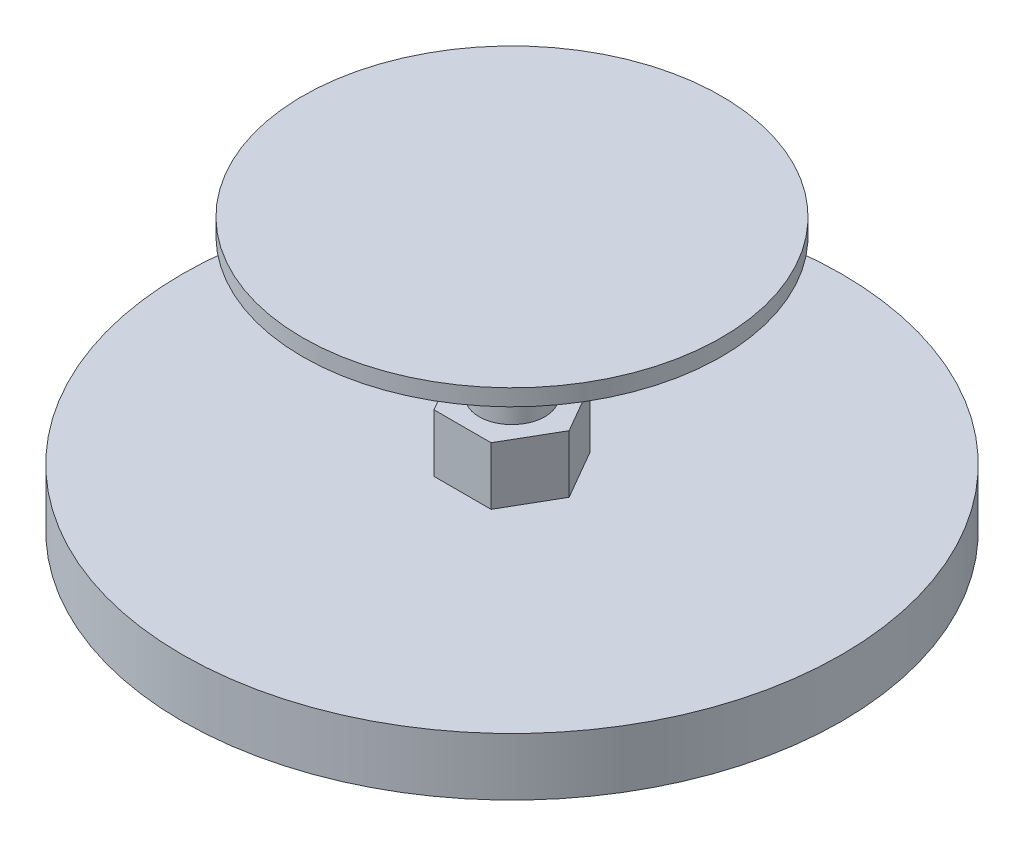
ISO-10303-21;
HEADER;
FILE_DESCRIPTION(('STEP AP214'),'2;1');
FILE_NAME('part.step','',(''),(''),'','','');
FILE_SCHEMA(('AUTOMOTIVE_DESIGN { 1 0 10303 214 1 1 1 1 }'));
ENDSEC;
DATA;
#1=APPLICATION_CONTEXT('core data for automotive mechanical design processes');
#2=APPLICATION_PROTOCOL_DEFINITION('international standard','automotive_design',2000,#1);
#3=PRODUCT_CONTEXT('',#1,'mechanical');
#4=PRODUCT('Part','Part','',(#3));
#5=PRODUCT_RELATED_PRODUCT_CATEGORY('part','',(#4));
#6=PRODUCT_DEFINITION_FORMATION('','',#4);
#7=PRODUCT_DEFINITION_CONTEXT('part definition',#1,'design');
#8=PRODUCT_DEFINITION('design','',#6,#7);
#9=PRODUCT_DEFINITION_SHAPE('','',#8);
#10=(LENGTH_UNIT() NAMED_UNIT(*) SI_UNIT(.MILLI.,.METRE.));
#11=(NAMED_UNIT(*) PLANE_ANGLE_UNIT() SI_UNIT($,.RADIAN.));
#12=(NAMED_UNIT(*) SI_UNIT($,.STERADIAN.) SOLID_ANGLE_UNIT());
#13=UNCERTAINTY_MEASURE_WITH_UNIT(LENGTH_MEASURE(1.E-05),#10,'distance_accuracy_value','');
#14=(GEOMETRIC_REPRESENTATION_CONTEXT(3) GLOBAL_UNCERTAINTY_ASSIGNED_CONTEXT((#13)) GLOBAL_UNIT_ASSIGNED_CONTEXT((#10,
#11,#12)) REPRESENTATION_CONTEXT('',''));
#15=CARTESIAN_POINT('',(0.,0.,0.));
#16=DIRECTION('',(0.,0.,1.));
#17=DIRECTION('',(1.,0.,0.));
#18=AXIS2_PLACEMENT_3D('',#15,#16,#17);
#19=CARTESIAN_POINT('',(6.92820323027551,14.,0.));
#20=DIRECTION('',(0.,1.,0.));
#21=DIRECTION('',(0.,0.,1.));
#22=AXIS2_PLACEMENT_3D('',#19,#20,#21);
#23=PLANE('',#22);
#24=DIRECTION('',(0.5,0.,-0.866025403784439));
#25=VECTOR('',#24,1.);
#26=CARTESIAN_POINT('',(3.46410161513775,14.,6.));
#27=LINE('',#26,#25);
#28=CARTESIAN_POINT('',(3.46410161513775,14.,6.));
#29=VERTEX_POINT('',#28);
#30=CARTESIAN_POINT('',(6.92820323027551,14.,0.));
#31=VERTEX_POINT('',#30);
#32=EDGE_CURVE('E131',#29,#31,#27,.T.);
#33=ORIENTED_EDGE('',*,*,#32,.T.);
#34=DIRECTION('',(-0.5,0.,-0.866025403784438));
#35=VECTOR('',#34,1.);
#36=CARTESIAN_POINT('',(6.92820323027551,14.,0.));
#37=LINE('',#36,#35);
#38=CARTESIAN_POINT('',(3.46410161513775,14.,-6.00000000000001));
#39=VERTEX_POINT('',#38);
#40=EDGE_CURVE('E83',#31,#39,#37,.T.);
#41=ORIENTED_EDGE('',*,*,#40,.T.);
#42=DIRECTION('',(-1.,0.,0.));
#43=VECTOR('',#42,1.);
#44=CARTESIAN_POINT('',(3.46410161513775,14.,-6.00000000000001));
#45=LINE('',#44,#43);
#46=CARTESIAN_POINT('',(-3.46410161513775,14.,-6.00000000000001));
#47=VERTEX_POINT('',#46);
#48=EDGE_CURVE('E99',#39,#47,#45,.T.);
#49=ORIENTED_EDGE('',*,*,#48,.T.);
#50=DIRECTION('',(-0.5,0.,0.866025403784439));
#51=VECTOR('',#50,1.);
#52=CARTESIAN_POINT('',(-3.46410161513775,14.,-6.00000000000001));
#53=LINE('',#52,#51);
#54=CARTESIAN_POINT('',(-6.92820323027551,14.,0.));
#55=VERTEX_POINT('',#54);
#56=EDGE_CURVE('E93',#47,#55,#53,.T.);
#57=ORIENTED_EDGE('',*,*,#56,.T.);
#58=DIRECTION('',(0.5,0.,0.866025403784439));
#59=VECTOR('',#58,1.);
#60=CARTESIAN_POINT('',(-6.92820323027551,14.,0.));
#61=LINE('',#60,#59);
#62=CARTESIAN_POINT('',(-3.46410161513776,14.,6.));
#63=VERTEX_POINT('',#62);
#64=EDGE_CURVE('E97',#55,#63,#61,.T.);
#65=ORIENTED_EDGE('',*,*,#64,.T.);
#66=DIRECTION('',(1.,0.,0.));
#67=VECTOR('',#66,1.);
#68=CARTESIAN_POINT('',(-3.46410161513776,14.,6.));
#69=LINE('',#68,#67);
#70=EDGE_CURVE('E54',#63,#29,#69,.T.);
#71=ORIENTED_EDGE('',*,*,#70,.T.);
#72=EDGE_LOOP('',(#33,#41,#49,#57,#65,#71));
#73=FACE_BOUND('',#72,.T.);
#74=CARTESIAN_POINT('',(0.,14.,0.));
#75=DIRECTION('',(0.,1.,0.));
#76=DIRECTION('',(0.,0.,1.));
#77=AXIS2_PLACEMENT_3D('',#74,#75,#76);
#78=CIRCLE('',#77,4.);
#79=CARTESIAN_POINT('',(0.,14.,4.));
#80=VERTEX_POINT('',#79);
#81=EDGE_CURVE('E189',#80,#80,#78,.T.);
#82=ORIENTED_EDGE('',*,*,#81,.F.);
#83=EDGE_LOOP('',(#82));
#84=FACE_BOUND('',#83,.T.);
#85=ADVANCED_FACE('F31',(#73,#84),#23,.T.);
#86=CARTESIAN_POINT('',(0.,7.,0.));
#87=DIRECTION('',(0.,1.,0.));
#88=DIRECTION('',(0.,0.,1.));
#89=AXIS2_PLACEMENT_3D('',#86,#87,#88);
#90=PLANE('',#89);
#91=CARTESIAN_POINT('',(0.,7.,0.));
#92=DIRECTION('',(0.,1.,0.));
#93=DIRECTION('',(0.,0.,1.));
#94=AXIS2_PLACEMENT_3D('',#91,#92,#93);
#95=CIRCLE('',#94,40.);
#96=CARTESIAN_POINT('',(0.,7.,40.));
#97=VERTEX_POINT('',#96);
#98=EDGE_CURVE('E11',#97,#97,#95,.T.);
#99=ORIENTED_EDGE('',*,*,#98,.T.);
#100=EDGE_LOOP('',(#99));
#101=FACE_BOUND('',#100,.T.);
#102=DIRECTION('',(-0.5,0.,-0.866025403784438));
#103=VECTOR('',#102,1.);
#104=CARTESIAN_POINT('',(6.92820323027551,7.,0.));
#105=LINE('',#104,#103);
#106=CARTESIAN_POINT('',(6.92820323027551,7.,0.));
#107=VERTEX_POINT('',#106);
#108=CARTESIAN_POINT('',(3.46410161513775,7.,-6.00000000000001));
#109=VERTEX_POINT('',#108);
#110=EDGE_CURVE('E122',#107,#109,#105,.T.);
#111=ORIENTED_EDGE('',*,*,#110,.F.);
#112=DIRECTION('',(0.5,0.,-0.866025403784439));
#113=VECTOR('',#112,1.);
#114=CARTESIAN_POINT('',(3.46410161513775,7.,6.));
#115=LINE('',#114,#113);
#116=CARTESIAN_POINT('',(3.46410161513775,7.,6.));
#117=VERTEX_POINT('',#116);
#118=EDGE_CURVE('E119',#117,#107,#115,.T.);
#119=ORIENTED_EDGE('',*,*,#118,.F.);
#120=DIRECTION('',(1.,0.,0.));
#121=VECTOR('',#120,1.);
#122=CARTESIAN_POINT('',(-3.46410161513776,7.,6.));
#123=LINE('',#122,#121);
#124=CARTESIAN_POINT('',(-3.46410161513776,7.,6.));
#125=VERTEX_POINT('',#124);
#126=EDGE_CURVE('E75',#125,#117,#123,.T.);
#127=ORIENTED_EDGE('',*,*,#126,.F.);
#128=DIRECTION('',(0.5,0.,0.866025403784439));
#129=VECTOR('',#128,1.);
#130=CARTESIAN_POINT('',(-6.92820323027551,7.,0.));
#131=LINE('',#130,#129);
#132=CARTESIAN_POINT('',(-6.92820323027551,7.,0.));
#133=VERTEX_POINT('',#132);
#134=EDGE_CURVE('E128',#133,#125,#131,.T.);
#135=ORIENTED_EDGE('',*,*,#134,.F.);
#136=DIRECTION('',(-0.5,0.,0.866025403784439));
#137=VECTOR('',#136,1.);
#138=CARTESIAN_POINT('',(-3.46410161513775,7.,-6.00000000000001));
#139=LINE('',#138,#137);
#140=CARTESIAN_POINT('',(-3.46410161513775,7.,-6.00000000000001));
#141=VERTEX_POINT('',#140);
#142=EDGE_CURVE('E108',#141,#133,#139,.T.);
#143=ORIENTED_EDGE('',*,*,#142,.F.);
#144=DIRECTION('',(-1.,0.,0.));
#145=VECTOR('',#144,1.);
#146=CARTESIAN_POINT('',(3.46410161513775,7.,-6.00000000000001));
#147=LINE('',#146,#145);
#148=EDGE_CURVE('E125',#109,#141,#147,.T.);
#149=ORIENTED_EDGE('',*,*,#148,.F.);
#150=EDGE_LOOP('',(#111,#119,#127,#135,#143,#149));
#151=FACE_BOUND('',#150,.T.);
#152=ADVANCED_FACE('F154',(#101,#151),#90,.T.);
#153=CARTESIAN_POINT('',(0.,7.,0.));
#154=DIRECTION('',(0.,-1.,0.));
#155=DIRECTION('',(0.,0.,-1.));
#156=AXIS2_PLACEMENT_3D('',#153,#154,#155);
#157=CYLINDRICAL_SURFACE('',#156,40.);
#158=ORIENTED_EDGE('',*,*,#98,.F.);
#159=EDGE_LOOP('',(#158));
#160=FACE_BOUND('',#159,.T.);
#161=CARTESIAN_POINT('',(0.,0.,0.));
#162=DIRECTION('',(0.,1.,0.));
#163=DIRECTION('',(0.,0.,1.));
#164=AXIS2_PLACEMENT_3D('',#161,#162,#163);
#165=CIRCLE('',#164,40.);
#166=CARTESIAN_POINT('',(0.,0.,40.));
#167=VERTEX_POINT('',#166);
#168=EDGE_CURVE('E35',#167,#167,#165,.T.);
#169=ORIENTED_EDGE('',*,*,#168,.T.);
#170=EDGE_LOOP('',(#169));
#171=FACE_BOUND('',#170,.T.);
#172=ADVANCED_FACE('F33',(#160,#171),#157,.T.);
#173=CARTESIAN_POINT('',(0.,0.,0.));
#174=DIRECTION('',(0.,1.,0.));
#175=DIRECTION('',(0.,0.,1.));
#176=AXIS2_PLACEMENT_3D('',#173,#174,#175);
#177=PLANE('',#176);
#178=ORIENTED_EDGE('',*,*,#168,.F.);
#179=EDGE_LOOP('',(#178));
#180=FACE_BOUND('',#179,.T.);
#181=ADVANCED_FACE('F144',(#180),#177,.F.);
#182=CARTESIAN_POINT('',(3.46410161513775,14.,6.));
#183=DIRECTION('',(-0.866025403784439,0.,-0.5));
#184=DIRECTION('',(-0.5,0.,0.866025403784439));
#185=AXIS2_PLACEMENT_3D('',#182,#183,#184);
#186=PLANE('',#185);
#187=ORIENTED_EDGE('',*,*,#118,.T.);
#188=DIRECTION('',(0.,-1.,0.));
#189=VECTOR('',#188,1.);
#190=CARTESIAN_POINT('',(6.92820323027551,14.,0.));
#191=LINE('',#190,#189);
#192=EDGE_CURVE('E138',#31,#107,#191,.T.);
#193=ORIENTED_EDGE('',*,*,#192,.F.);
#194=ORIENTED_EDGE('',*,*,#32,.F.);
#195=DIRECTION('',(0.,-1.,0.));
#196=VECTOR('',#195,1.);
#197=CARTESIAN_POINT('',(3.46410161513775,14.,6.));
#198=LINE('',#197,#196);
#199=EDGE_CURVE('E115',#29,#117,#198,.T.);
#200=ORIENTED_EDGE('',*,*,#199,.T.);
#201=EDGE_LOOP('',(#187,#193,#194,#200));
#202=FACE_BOUND('',#201,.T.);
#203=ADVANCED_FACE('F146',(#202),#186,.F.);
#204=CARTESIAN_POINT('',(6.92820323027551,14.,0.));
#205=DIRECTION('',(-0.866025403784438,0.,0.5));
#206=DIRECTION('',(0.5,0.,0.866025403784439));
#207=AXIS2_PLACEMENT_3D('',#204,#205,#206);
#208=PLANE('',#207);
#209=ORIENTED_EDGE('',*,*,#110,.T.);
#210=DIRECTION('',(0.,-1.,0.));
#211=VECTOR('',#210,1.);
#212=CARTESIAN_POINT('',(3.46410161513775,14.,-6.00000000000001));
#213=LINE('',#212,#211);
#214=EDGE_CURVE('E135',#39,#109,#213,.T.);
#215=ORIENTED_EDGE('',*,*,#214,.F.);
#216=ORIENTED_EDGE('',*,*,#40,.F.);
#217=ORIENTED_EDGE('',*,*,#192,.T.);
#218=EDGE_LOOP('',(#209,#215,#216,#217));
#219=FACE_BOUND('',#218,.T.);
#220=ADVANCED_FACE('F151',(#219),#208,.F.);
#221=CARTESIAN_POINT('',(3.46410161513775,14.,-6.00000000000001));
#222=DIRECTION('',(0.,0.,1.));
#223=DIRECTION('',(1.,0.,0.));
#224=AXIS2_PLACEMENT_3D('',#221,#222,#223);
#225=PLANE('',#224);
#226=ORIENTED_EDGE('',*,*,#148,.T.);
#227=DIRECTION('',(0.,-1.,0.));
#228=VECTOR('',#227,1.);
#229=CARTESIAN_POINT('',(-3.46410161513775,14.,-6.00000000000001));
#230=LINE('',#229,#228);
#231=EDGE_CURVE('E111',#47,#141,#230,.T.);
#232=ORIENTED_EDGE('',*,*,#231,.F.);
#233=ORIENTED_EDGE('',*,*,#48,.F.);
#234=ORIENTED_EDGE('',*,*,#214,.T.);
#235=EDGE_LOOP('',(#226,#232,#233,#234));
#236=FACE_BOUND('',#235,.T.);
#237=ADVANCED_FACE('F174',(#236),#225,.F.);
#238=CARTESIAN_POINT('',(-3.46410161513775,14.,-6.00000000000001));
#239=DIRECTION('',(0.866025403784439,0.,0.5));
#240=DIRECTION('',(0.5,0.,-0.866025403784439));
#241=AXIS2_PLACEMENT_3D('',#238,#239,#240);
#242=PLANE('',#241);
#243=ORIENTED_EDGE('',*,*,#142,.T.);
#244=DIRECTION('',(0.,-1.,0.));
#245=VECTOR('',#244,1.);
#246=CARTESIAN_POINT('',(-6.92820323027551,14.,0.));
#247=LINE('',#246,#245);
#248=EDGE_CURVE('E105',#55,#133,#247,.T.);
#249=ORIENTED_EDGE('',*,*,#248,.F.);
#250=ORIENTED_EDGE('',*,*,#56,.F.);
#251=ORIENTED_EDGE('',*,*,#231,.T.);
#252=EDGE_LOOP('',(#243,#249,#250,#251));
#253=FACE_BOUND('',#252,.T.);
#254=ADVANCED_FACE('F106',(#253),#242,.F.);
#255=CARTESIAN_POINT('',(-6.92820323027551,14.,0.));
#256=DIRECTION('',(0.866025403784439,0.,-0.5));
#257=DIRECTION('',(-0.5,0.,-0.866025403784439));
#258=AXIS2_PLACEMENT_3D('',#255,#256,#257);
#259=PLANE('',#258);
#260=ORIENTED_EDGE('',*,*,#134,.T.);
#261=DIRECTION('',(0.,-1.,0.));
#262=VECTOR('',#261,1.);
#263=CARTESIAN_POINT('',(-3.46410161513776,14.,6.));
#264=LINE('',#263,#262);
#265=EDGE_CURVE('E46',#63,#125,#264,.T.);
#266=ORIENTED_EDGE('',*,*,#265,.F.);
#267=ORIENTED_EDGE('',*,*,#64,.F.);
#268=ORIENTED_EDGE('',*,*,#248,.T.);
#269=EDGE_LOOP('',(#260,#266,#267,#268));
#270=FACE_BOUND('',#269,.T.);
#271=ADVANCED_FACE('F113',(#270),#259,.F.);
#272=CARTESIAN_POINT('',(-3.46410161513776,14.,6.));
#273=DIRECTION('',(0.,0.,-1.));
#274=DIRECTION('',(-1.,0.,0.));
#275=AXIS2_PLACEMENT_3D('',#272,#273,#274);
#276=PLANE('',#275);
#277=ORIENTED_EDGE('',*,*,#126,.T.);
#278=ORIENTED_EDGE('',*,*,#199,.F.);
#279=ORIENTED_EDGE('',*,*,#70,.F.);
#280=ORIENTED_EDGE('',*,*,#265,.T.);
#281=EDGE_LOOP('',(#277,#278,#279,#280));
#282=FACE_BOUND('',#281,.T.);
#283=ADVANCED_FACE('F167',(#282),#276,.F.);
#284=CARTESIAN_POINT('',(0.,24.,0.));
#285=DIRECTION('',(0.,-1.,0.));
#286=DIRECTION('',(0.,0.,-1.));
#287=AXIS2_PLACEMENT_3D('',#284,#285,#286);
#288=CYLINDRICAL_SURFACE('',#287,4.);
#289=CARTESIAN_POINT('',(0.,24.,0.));
#290=DIRECTION('',(0.,1.,0.));
#291=DIRECTION('',(0.,0.,1.));
#292=AXIS2_PLACEMENT_3D('',#289,#290,#291);
#293=CIRCLE('',#292,4.);
#294=CARTESIAN_POINT('',(0.,24.,4.));
#295=VERTEX_POINT('',#294);
#296=EDGE_CURVE('E123',#295,#295,#293,.T.);
#297=ORIENTED_EDGE('',*,*,#296,.F.);
#298=EDGE_LOOP('',(#297));
#299=FACE_BOUND('',#298,.T.);
#300=ORIENTED_EDGE('',*,*,#81,.T.);
#301=EDGE_LOOP('',(#300));
#302=FACE_BOUND('',#301,.T.);
#303=ADVANCED_FACE('F165',(#299,#302),#288,.T.);
#304=CARTESIAN_POINT('',(6.92820323027551,24.,0.));
#305=DIRECTION('',(0.,1.,0.));
#306=DIRECTION('',(0.,0.,1.));
#307=AXIS2_PLACEMENT_3D('',#304,#305,#306);
#308=PLANE('',#307);
#309=DIRECTION('',(0.499999999999995,0.,-0.866025403784442));
#310=VECTOR('',#309,1.);
#311=CARTESIAN_POINT('',(3.46410161513783,24.,5.99999999999996));
#312=LINE('',#311,#310);
#313=CARTESIAN_POINT('',(3.46410161513783,24.,5.99999999999996));
#314=VERTEX_POINT('',#313);
#315=CARTESIAN_POINT('',(6.92820323027551,24.,0.));
#316=VERTEX_POINT('',#315);
#317=EDGE_CURVE('E229',#314,#316,#312,.T.);
#318=ORIENTED_EDGE('',*,*,#317,.F.);
#319=DIRECTION('',(1.,0.,0.));
#320=VECTOR('',#319,1.);
#321=CARTESIAN_POINT('',(-3.46410161513769,24.,6.00000000000003));
#322=LINE('',#321,#320);
#323=CARTESIAN_POINT('',(-3.46410161513769,24.,6.00000000000003));
#324=VERTEX_POINT('',#323);
#325=EDGE_CURVE('E213',#324,#314,#322,.T.);
#326=ORIENTED_EDGE('',*,*,#325,.F.);
#327=DIRECTION('',(0.500000000000008,0.,0.866025403784434));
#328=VECTOR('',#327,1.);
#329=CARTESIAN_POINT('',(-6.92820323027551,24.,0.));
#330=LINE('',#329,#328);
#331=CARTESIAN_POINT('',(-6.92820323027551,24.,0.));
#332=VERTEX_POINT('',#331);
#333=EDGE_CURVE('E217',#332,#324,#330,.T.);
#334=ORIENTED_EDGE('',*,*,#333,.F.);
#335=DIRECTION('',(-0.499999999999995,0.,0.866025403784442));
#336=VECTOR('',#335,1.);
#337=CARTESIAN_POINT('',(-3.46410161513778,24.,-5.99999999999998));
#338=LINE('',#337,#336);
#339=CARTESIAN_POINT('',(-3.46410161513778,24.,-5.99999999999998));
#340=VERTEX_POINT('',#339);
#341=EDGE_CURVE('E220',#340,#332,#338,.T.);
#342=ORIENTED_EDGE('',*,*,#341,.F.);
#343=DIRECTION('',(-1.,0.,0.));
#344=VECTOR('',#343,1.);
#345=CARTESIAN_POINT('',(3.46410161513774,24.,-6.00000000000001));
#346=LINE('',#345,#344);
#347=CARTESIAN_POINT('',(3.46410161513774,24.,-6.00000000000001));
#348=VERTEX_POINT('',#347);
#349=EDGE_CURVE('E223',#348,#340,#346,.T.);
#350=ORIENTED_EDGE('',*,*,#349,.F.);
#351=DIRECTION('',(-0.500000000000001,0.,-0.866025403784438));
#352=VECTOR('',#351,1.);
#353=CARTESIAN_POINT('',(6.92820323027551,24.,0.));
#354=LINE('',#353,#352);
#355=EDGE_CURVE('E226',#316,#348,#354,.T.);
#356=ORIENTED_EDGE('',*,*,#355,.F.);
#357=EDGE_LOOP('',(#318,#326,#334,#342,#350,#356));
#358=FACE_BOUND('',#357,.T.);
#359=ORIENTED_EDGE('',*,*,#296,.T.);
#360=EDGE_LOOP('',(#359));
#361=FACE_BOUND('',#360,.T.);
#362=ADVANCED_FACE('F329',(#358,#361),#308,.F.);
#363=CARTESIAN_POINT('',(3.46410161513783,31.,5.99999999999996));
#364=DIRECTION('',(-0.866025403784442,0.,-0.499999999999995));
#365=DIRECTION('',(-0.499999999999995,0.,0.866025403784442));
#366=AXIS2_PLACEMENT_3D('',#363,#364,#365);
#367=PLANE('',#366);
#368=ORIENTED_EDGE('',*,*,#317,.T.);
#369=DIRECTION('',(0.,-1.,0.));
#370=VECTOR('',#369,1.);
#371=CARTESIAN_POINT('',(6.92820323027551,31.,0.));
#372=LINE('',#371,#370);
#373=CARTESIAN_POINT('',(6.92820323027551,31.,0.));
#374=VERTEX_POINT('',#373);
#375=EDGE_CURVE('E192',#374,#316,#372,.T.);
#376=ORIENTED_EDGE('',*,*,#375,.F.);
#377=DIRECTION('',(0.499999999999995,0.,-0.866025403784442));
#378=VECTOR('',#377,1.);
#379=CARTESIAN_POINT('',(3.46410161513783,31.,5.99999999999996));
#380=LINE('',#379,#378);
#381=CARTESIAN_POINT('',(3.46410161513783,31.,5.99999999999996));
#382=VERTEX_POINT('',#381);
#383=EDGE_CURVE('E216',#382,#374,#380,.T.);
#384=ORIENTED_EDGE('',*,*,#383,.F.);
#385=DIRECTION('',(0.,-1.,0.));
#386=VECTOR('',#385,1.);
#387=CARTESIAN_POINT('',(3.46410161513783,31.,5.99999999999996));
#388=LINE('',#387,#386);
#389=EDGE_CURVE('E209',#382,#314,#388,.T.);
#390=ORIENTED_EDGE('',*,*,#389,.T.);
#391=EDGE_LOOP('',(#368,#376,#384,#390));
#392=FACE_BOUND('',#391,.T.);
#393=ADVANCED_FACE('F327',(#392),#367,.F.);
#394=CARTESIAN_POINT('',(6.92820323027551,31.,0.));
#395=DIRECTION('',(-0.866025403784438,0.,0.500000000000001));
#396=DIRECTION('',(0.500000000000001,0.,0.866025403784438));
#397=AXIS2_PLACEMENT_3D('',#394,#395,#396);
#398=PLANE('',#397);
#399=ORIENTED_EDGE('',*,*,#355,.T.);
#400=DIRECTION('',(0.,-1.,0.));
#401=VECTOR('',#400,1.);
#402=CARTESIAN_POINT('',(3.46410161513774,31.,-6.00000000000001));
#403=LINE('',#402,#401);
#404=CARTESIAN_POINT('',(3.46410161513774,31.,-6.00000000000001));
#405=VERTEX_POINT('',#404);
#406=EDGE_CURVE('E197',#405,#348,#403,.T.);
#407=ORIENTED_EDGE('',*,*,#406,.F.);
#408=DIRECTION('',(-0.500000000000001,0.,-0.866025403784438));
#409=VECTOR('',#408,1.);
#410=CARTESIAN_POINT('',(6.92820323027551,31.,0.));
#411=LINE('',#410,#409);
#412=EDGE_CURVE('E244',#374,#405,#411,.T.);
#413=ORIENTED_EDGE('',*,*,#412,.F.);
#414=ORIENTED_EDGE('',*,*,#375,.T.);
#415=EDGE_LOOP('',(#399,#407,#413,#414));
#416=FACE_BOUND('',#415,.T.);
#417=ADVANCED_FACE('F325',(#416),#398,.F.);
#418=CARTESIAN_POINT('',(3.46410161513774,31.,-6.00000000000001));
#419=DIRECTION('',(0.,0.,1.));
#420=DIRECTION('',(1.,0.,0.));
#421=AXIS2_PLACEMENT_3D('',#418,#419,#420);
#422=PLANE('',#421);
#423=ORIENTED_EDGE('',*,*,#349,.T.);
#424=DIRECTION('',(0.,-1.,0.));
#425=VECTOR('',#424,1.);
#426=CARTESIAN_POINT('',(-3.46410161513778,31.,-5.99999999999998));
#427=LINE('',#426,#425);
#428=CARTESIAN_POINT('',(-3.46410161513778,31.,-5.99999999999998));
#429=VERTEX_POINT('',#428);
#430=EDGE_CURVE('E200',#429,#340,#427,.T.);
#431=ORIENTED_EDGE('',*,*,#430,.F.);
#432=DIRECTION('',(-1.,0.,0.));
#433=VECTOR('',#432,1.);
#434=CARTESIAN_POINT('',(3.46410161513774,31.,-6.00000000000001));
#435=LINE('',#434,#433);
#436=EDGE_CURVE('E241',#405,#429,#435,.T.);
#437=ORIENTED_EDGE('',*,*,#436,.F.);
#438=ORIENTED_EDGE('',*,*,#406,.T.);
#439=EDGE_LOOP('',(#423,#431,#437,#438));
#440=FACE_BOUND('',#439,.T.);
#441=ADVANCED_FACE('F307',(#440),#422,.F.);
#442=CARTESIAN_POINT('',(-3.46410161513778,31.,-5.99999999999998));
#443=DIRECTION('',(0.866025403784442,0.,0.499999999999995));
#444=DIRECTION('',(0.499999999999995,0.,-0.866025403784442));
#445=AXIS2_PLACEMENT_3D('',#442,#443,#444);
#446=PLANE('',#445);
#447=ORIENTED_EDGE('',*,*,#341,.T.);
#448=DIRECTION('',(0.,-1.,0.));
#449=VECTOR('',#448,1.);
#450=CARTESIAN_POINT('',(-6.92820323027551,31.,0.));
#451=LINE('',#450,#449);
#452=CARTESIAN_POINT('',(-6.92820323027551,31.,0.));
#453=VERTEX_POINT('',#452);
#454=EDGE_CURVE('E203',#453,#332,#451,.T.);
#455=ORIENTED_EDGE('',*,*,#454,.F.);
#456=DIRECTION('',(-0.499999999999995,0.,0.866025403784442));
#457=VECTOR('',#456,1.);
#458=CARTESIAN_POINT('',(-3.46410161513778,31.,-5.99999999999998));
#459=LINE('',#458,#457);
#460=EDGE_CURVE('E238',#429,#453,#459,.T.);
#461=ORIENTED_EDGE('',*,*,#460,.F.);
#462=ORIENTED_EDGE('',*,*,#430,.T.);
#463=EDGE_LOOP('',(#447,#455,#461,#462));
#464=FACE_BOUND('',#463,.T.);
#465=ADVANCED_FACE('F311',(#464),#446,.F.);
#466=CARTESIAN_POINT('',(-6.92820323027551,31.,0.));
#467=DIRECTION('',(0.866025403784434,0.,-0.500000000000008));
#468=DIRECTION('',(-0.500000000000008,0.,-0.866025403784434));
#469=AXIS2_PLACEMENT_3D('',#466,#467,#468);
#470=PLANE('',#469);
#471=ORIENTED_EDGE('',*,*,#333,.T.);
#472=DIRECTION('',(0.,-1.,0.));
#473=VECTOR('',#472,1.);
#474=CARTESIAN_POINT('',(-3.46410161513769,31.,6.00000000000003));
#475=LINE('',#474,#473);
#476=CARTESIAN_POINT('',(-3.46410161513769,31.,6.00000000000003));
#477=VERTEX_POINT('',#476);
#478=EDGE_CURVE('E206',#477,#324,#475,.T.);
#479=ORIENTED_EDGE('',*,*,#478,.F.);
#480=DIRECTION('',(0.500000000000008,0.,0.866025403784434));
#481=VECTOR('',#480,1.);
#482=CARTESIAN_POINT('',(-6.92820323027551,31.,0.));
#483=LINE('',#482,#481);
#484=EDGE_CURVE('E235',#453,#477,#483,.T.);
#485=ORIENTED_EDGE('',*,*,#484,.F.);
#486=ORIENTED_EDGE('',*,*,#454,.T.);
#487=EDGE_LOOP('',(#471,#479,#485,#486));
#488=FACE_BOUND('',#487,.T.);
#489=ADVANCED_FACE('F312',(#488),#470,.F.);
#490=CARTESIAN_POINT('',(-3.46410161513769,31.,6.00000000000003));
#491=DIRECTION('',(0.,0.,-1.));
#492=DIRECTION('',(-1.,0.,0.));
#493=AXIS2_PLACEMENT_3D('',#490,#491,#492);
#494=PLANE('',#493);
#495=ORIENTED_EDGE('',*,*,#325,.T.);
#496=ORIENTED_EDGE('',*,*,#389,.F.);
#497=DIRECTION('',(1.,0.,0.));
#498=VECTOR('',#497,1.);
#499=CARTESIAN_POINT('',(-3.46410161513769,31.,6.00000000000003));
#500=LINE('',#499,#498);
#501=EDGE_CURVE('E212',#477,#382,#500,.T.);
#502=ORIENTED_EDGE('',*,*,#501,.F.);
#503=ORIENTED_EDGE('',*,*,#478,.T.);
#504=EDGE_LOOP('',(#495,#496,#502,#503));
#505=FACE_BOUND('',#504,.T.);
#506=ADVANCED_FACE('F266',(#505),#494,.F.);
#507=CARTESIAN_POINT('',(0.,31.,0.));
#508=DIRECTION('',(0.,1.,0.));
#509=DIRECTION('',(0.,0.,1.));
#510=AXIS2_PLACEMENT_3D('',#507,#508,#509);
#511=PLANE('',#510);
#512=CARTESIAN_POINT('',(0.,31.,0.));
#513=DIRECTION('',(0.,1.,0.));
#514=DIRECTION('',(0.,0.,1.));
#515=AXIS2_PLACEMENT_3D('',#512,#513,#514);
#516=CIRCLE('',#515,25.4);
#517=CARTESIAN_POINT('',(0.,31.,25.4));
#518=VERTEX_POINT('',#517);
#519=EDGE_CURVE('E249',#518,#518,#516,.T.);
#520=ORIENTED_EDGE('',*,*,#519,.F.);
#521=EDGE_LOOP('',(#520));
#522=FACE_BOUND('',#521,.T.);
#523=ORIENTED_EDGE('',*,*,#501,.T.);
#524=ORIENTED_EDGE('',*,*,#383,.T.);
#525=ORIENTED_EDGE('',*,*,#412,.T.);
#526=ORIENTED_EDGE('',*,*,#436,.T.);
#527=ORIENTED_EDGE('',*,*,#460,.T.);
#528=ORIENTED_EDGE('',*,*,#484,.T.);
#529=EDGE_LOOP('',(#523,#524,#525,#526,#527,#528));
#530=FACE_BOUND('',#529,.T.);
#531=ADVANCED_FACE('F260',(#522,#530),#511,.F.);
#532=CARTESIAN_POINT('',(0.,33.,0.));
#533=DIRECTION('',(0.,-1.,0.));
#534=DIRECTION('',(0.,0.,-1.));
#535=AXIS2_PLACEMENT_3D('',#532,#533,#534);
#536=CYLINDRICAL_SURFACE('',#535,25.4);
#537=CARTESIAN_POINT('',(0.,33.,0.));
#538=DIRECTION('',(0.,1.,0.));
#539=DIRECTION('',(0.,0.,1.));
#540=AXIS2_PLACEMENT_3D('',#537,#538,#539);
#541=CIRCLE('',#540,25.4);
#542=CARTESIAN_POINT('',(0.,33.,25.4));
#543=VERTEX_POINT('',#542);
#544=EDGE_CURVE('E232',#543,#543,#541,.T.);
#545=ORIENTED_EDGE('',*,*,#544,.F.);
#546=EDGE_LOOP('',(#545));
#547=FACE_BOUND('',#546,.T.);
#548=ORIENTED_EDGE('',*,*,#519,.T.);
#549=EDGE_LOOP('',(#548));
#550=FACE_BOUND('',#549,.T.);
#551=ADVANCED_FACE('F257',(#547,#550),#536,.T.);
#552=CARTESIAN_POINT('',(0.,33.,0.));
#553=DIRECTION('',(0.,1.,0.));
#554=DIRECTION('',(0.,0.,1.));
#555=AXIS2_PLACEMENT_3D('',#552,#553,#554);
#556=PLANE('',#555);
#557=ORIENTED_EDGE('',*,*,#544,.T.);
#558=EDGE_LOOP('',(#557));
#559=FACE_BOUND('',#558,.T.);
#560=ADVANCED_FACE('F255',(#559),#556,.T.);
#561=CLOSED_SHELL('',(#85,#152,#172,#181,#203,#220,#237,#254,#271,#283,#303,#362,#393,#417,#441,
#465,#489,#506,#531,#551,#560));
#562=MANIFOLD_SOLID_BREP('B2',#561);
#563=ADVANCED_BREP_SHAPE_REPRESENTATION('',(#18,#562),#14);
#564=SHAPE_DEFINITION_REPRESENTATION(#9,#563);
ENDSEC;
END-ISO-10303-21;
